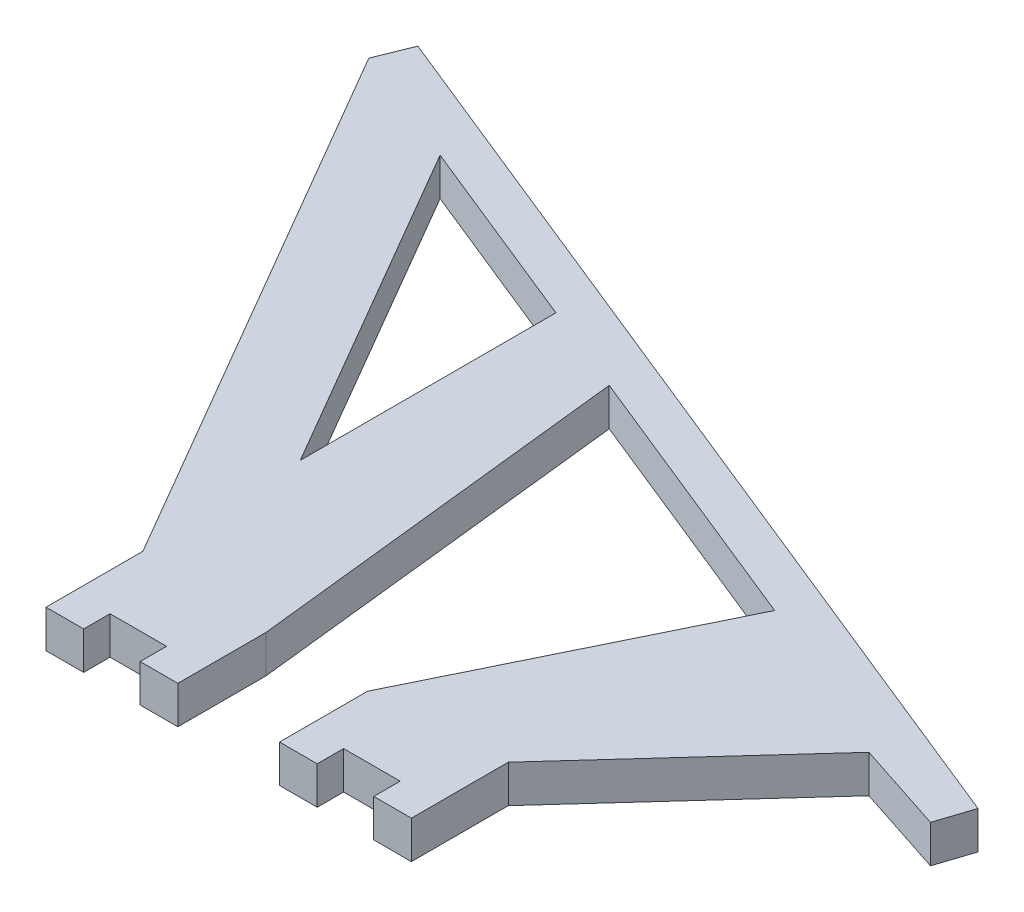
ISO-10303-21;
HEADER;
FILE_DESCRIPTION(('STEP AP214'),'2;1');
FILE_NAME('part.step','',(''),(''),'','','');
FILE_SCHEMA(('AUTOMOTIVE_DESIGN { 1 0 10303 214 1 1 1 1 }'));
ENDSEC;
DATA;
#1=APPLICATION_CONTEXT('core data for automotive mechanical design processes');
#2=APPLICATION_PROTOCOL_DEFINITION('international standard','automotive_design',2000,#1);
#3=PRODUCT_CONTEXT('',#1,'mechanical');
#4=PRODUCT('Part','Part','',(#3));
#5=PRODUCT_RELATED_PRODUCT_CATEGORY('part','',(#4));
#6=PRODUCT_DEFINITION_FORMATION('','',#4);
#7=PRODUCT_DEFINITION_CONTEXT('part definition',#1,'design');
#8=PRODUCT_DEFINITION('design','',#6,#7);
#9=PRODUCT_DEFINITION_SHAPE('','',#8);
#10=(LENGTH_UNIT() NAMED_UNIT(*) SI_UNIT(.MILLI.,.METRE.));
#11=(NAMED_UNIT(*) PLANE_ANGLE_UNIT() SI_UNIT($,.RADIAN.));
#12=(NAMED_UNIT(*) SI_UNIT($,.STERADIAN.) SOLID_ANGLE_UNIT());
#13=UNCERTAINTY_MEASURE_WITH_UNIT(LENGTH_MEASURE(1.E-05),#10,'distance_accuracy_value','');
#14=(GEOMETRIC_REPRESENTATION_CONTEXT(3) GLOBAL_UNCERTAINTY_ASSIGNED_CONTEXT((#13)) GLOBAL_UNIT_ASSIGNED_CONTEXT((#10,
#11,#12)) REPRESENTATION_CONTEXT('',''));
#15=CARTESIAN_POINT('',(0.,0.,0.));
#16=DIRECTION('',(0.,0.,1.));
#17=DIRECTION('',(1.,0.,0.));
#18=AXIS2_PLACEMENT_3D('',#15,#16,#17);
#19=CARTESIAN_POINT('',(-48.5,10.,0.));
#20=DIRECTION('',(1.,0.,0.));
#21=DIRECTION('',(0.,0.,-1.));
#22=AXIS2_PLACEMENT_3D('',#19,#20,#21);
#23=PLANE('',#22);
#24=DIRECTION('',(0.,0.,1.));
#25=VECTOR('',#24,1.);
#26=CARTESIAN_POINT('',(-48.5,0.,0.));
#27=LINE('',#26,#25);
#28=CARTESIAN_POINT('',(-48.5,0.,-125.232815318677));
#29=VERTEX_POINT('',#28);
#30=CARTESIAN_POINT('',(-48.5,0.,-57.3695773199546));
#31=VERTEX_POINT('',#30);
#32=EDGE_CURVE('E237',#29,#31,#27,.T.);
#33=ORIENTED_EDGE('',*,*,#32,.T.);
#34=DIRECTION('',(0.,-1.,0.));
#35=VECTOR('',#34,1.);
#36=CARTESIAN_POINT('',(-48.5,10.,-57.3695773199546));
#37=LINE('',#36,#35);
#38=CARTESIAN_POINT('',(-48.5,10.,-57.3695773199546));
#39=VERTEX_POINT('',#38);
#40=EDGE_CURVE('E11',#39,#31,#37,.T.);
#41=ORIENTED_EDGE('',*,*,#40,.F.);
#42=DIRECTION('',(0.,0.,1.));
#43=VECTOR('',#42,1.);
#44=CARTESIAN_POINT('',(-48.5,10.,0.));
#45=LINE('',#44,#43);
#46=CARTESIAN_POINT('',(-48.5,10.,-125.232815318677));
#47=VERTEX_POINT('',#46);
#48=EDGE_CURVE('E228',#47,#39,#45,.T.);
#49=ORIENTED_EDGE('',*,*,#48,.F.);
#50=DIRECTION('',(0.,-1.,0.));
#51=VECTOR('',#50,1.);
#52=CARTESIAN_POINT('',(-48.5,10.,-125.232815318677));
#53=LINE('',#52,#51);
#54=EDGE_CURVE('E238',#47,#29,#53,.T.);
#55=ORIENTED_EDGE('',*,*,#54,.T.);
#56=EDGE_LOOP('',(#33,#41,#49,#55));
#57=FACE_BOUND('',#56,.T.);
#58=ADVANCED_FACE('F41',(#57),#23,.F.);
#59=CARTESIAN_POINT('',(-11.3048115976021,10.,6.57569485477312));
#60=DIRECTION('',(-0.864403175611041,0.,0.502799313835598));
#61=DIRECTION('',(0.502799313835599,0.,0.864403175611041));
#62=AXIS2_PLACEMENT_3D('',#59,#60,#61);
#63=PLANE('',#62);
#64=DIRECTION('',(-0.502799313835598,0.,-0.864403175611041));
#65=VECTOR('',#64,1.);
#66=CARTESIAN_POINT('',(-11.3048115976021,0.,6.57569485477312));
#67=LINE('',#66,#65);
#68=CARTESIAN_POINT('',(-100.110149338396,0.,-146.096780707619));
#69=VERTEX_POINT('',#68);
#70=EDGE_CURVE('E142',#31,#69,#67,.T.);
#71=ORIENTED_EDGE('',*,*,#70,.T.);
#72=DIRECTION('',(0.,-1.,0.));
#73=VECTOR('',#72,1.);
#74=CARTESIAN_POINT('',(-100.110149338396,10.,-146.096780707619));
#75=LINE('',#74,#73);
#76=CARTESIAN_POINT('',(-100.110149338396,10.,-146.096780707619));
#77=VERTEX_POINT('',#76);
#78=EDGE_CURVE('E52',#77,#69,#75,.T.);
#79=ORIENTED_EDGE('',*,*,#78,.F.);
#80=DIRECTION('',(-0.502799313835598,0.,-0.864403175611041));
#81=VECTOR('',#80,1.);
#82=CARTESIAN_POINT('',(-11.3048115976021,10.,6.57569485477312));
#83=LINE('',#82,#81);
#84=EDGE_CURVE('E223',#39,#77,#83,.T.);
#85=ORIENTED_EDGE('',*,*,#84,.F.);
#86=ORIENTED_EDGE('',*,*,#40,.T.);
#87=EDGE_LOOP('',(#71,#79,#85,#86));
#88=FACE_BOUND('',#87,.T.);
#89=ADVANCED_FACE('F224',(#88),#63,.F.);
#90=CARTESIAN_POINT('',(-29.457278285434,10.,17.1344804453207));
#91=DIRECTION('',(-0.864403175611041,0.,0.502799313835598));
#92=DIRECTION('',(0.502799313835599,0.,0.864403175611041));
#93=AXIS2_PLACEMENT_3D('',#90,#91,#92);
#94=PLANE('',#93);
#95=DIRECTION('',(-0.502799313835598,0.,-0.864403175611041));
#96=VECTOR('',#95,1.);
#97=CARTESIAN_POINT('',(-29.457278285434,0.,17.1344804453207));
#98=LINE('',#97,#96);
#99=CARTESIAN_POINT('',(-48.5,0.,-15.6034105370253));
#100=VERTEX_POINT('',#99);
#101=CARTESIAN_POINT('',(-131.873415703611,0.,-158.937427335832));
#102=VERTEX_POINT('',#101);
#103=EDGE_CURVE('E340',#100,#102,#98,.T.);
#104=ORIENTED_EDGE('',*,*,#103,.F.);
#105=DIRECTION('',(0.,-1.,0.));
#106=VECTOR('',#105,1.);
#107=CARTESIAN_POINT('',(-48.5,10.,-15.6034105370253));
#108=LINE('',#107,#106);
#109=CARTESIAN_POINT('',(-48.5,10.,-15.6034105370253));
#110=VERTEX_POINT('',#109);
#111=EDGE_CURVE('E45',#110,#100,#108,.T.);
#112=ORIENTED_EDGE('',*,*,#111,.F.);
#113=DIRECTION('',(-0.502799313835598,0.,-0.864403175611041));
#114=VECTOR('',#113,1.);
#115=CARTESIAN_POINT('',(-29.457278285434,10.,17.1344804453207));
#116=LINE('',#115,#114);
#117=CARTESIAN_POINT('',(-131.873415703611,10.,-158.937427335832));
#118=VERTEX_POINT('',#117);
#119=EDGE_CURVE('E253',#110,#118,#116,.T.);
#120=ORIENTED_EDGE('',*,*,#119,.T.);
#121=DIRECTION('',(0.,-1.,0.));
#122=VECTOR('',#121,1.);
#123=CARTESIAN_POINT('',(-131.873415703611,10.,-158.937427335832));
#124=LINE('',#123,#122);
#125=EDGE_CURVE('E258',#118,#102,#124,.T.);
#126=ORIENTED_EDGE('',*,*,#125,.T.);
#127=EDGE_LOOP('',(#104,#112,#120,#126));
#128=FACE_BOUND('',#127,.T.);
#129=ADVANCED_FACE('F43',(#128),#94,.T.);
#130=CARTESIAN_POINT('',(-48.5,10.,0.));
#131=DIRECTION('',(-1.,0.,0.));
#132=DIRECTION('',(0.,0.,1.));
#133=AXIS2_PLACEMENT_3D('',#130,#131,#132);
#134=PLANE('',#133);
#135=DIRECTION('',(0.,0.,-1.));
#136=VECTOR('',#135,1.);
#137=CARTESIAN_POINT('',(-48.5,0.,0.));
#138=LINE('',#137,#136);
#139=CARTESIAN_POINT('',(-48.5,0.,10.1281938448075));
#140=VERTEX_POINT('',#139);
#141=EDGE_CURVE('E336',#140,#100,#138,.T.);
#142=ORIENTED_EDGE('',*,*,#141,.F.);
#143=DIRECTION('',(0.,-1.,0.));
#144=VECTOR('',#143,1.);
#145=CARTESIAN_POINT('',(-48.5,10.,10.1281938448075));
#146=LINE('',#145,#144);
#147=CARTESIAN_POINT('',(-48.5,10.,10.1281938448075));
#148=VERTEX_POINT('',#147);
#149=EDGE_CURVE('E324',#148,#140,#146,.T.);
#150=ORIENTED_EDGE('',*,*,#149,.F.);
#151=DIRECTION('',(0.,0.,-1.));
#152=VECTOR('',#151,1.);
#153=CARTESIAN_POINT('',(-48.5,10.,0.));
#154=LINE('',#153,#152);
#155=EDGE_CURVE('E338',#148,#110,#154,.T.);
#156=ORIENTED_EDGE('',*,*,#155,.T.);
#157=ORIENTED_EDGE('',*,*,#111,.T.);
#158=EDGE_LOOP('',(#142,#150,#156,#157));
#159=FACE_BOUND('',#158,.T.);
#160=ADVANCED_FACE('F334',(#159),#134,.T.);
#161=CARTESIAN_POINT('',(0.,10.,10.1281938448075));
#162=DIRECTION('',(0.,0.,-1.));
#163=DIRECTION('',(-1.,0.,0.));
#164=AXIS2_PLACEMENT_3D('',#161,#162,#163);
#165=PLANE('',#164);
#166=DIRECTION('',(1.,0.,0.));
#167=VECTOR('',#166,1.);
#168=CARTESIAN_POINT('',(0.,0.,10.1281938448075));
#169=LINE('',#168,#167);
#170=CARTESIAN_POINT('',(-38.5,0.,10.1281938448075));
#171=VERTEX_POINT('',#170);
#172=EDGE_CURVE('E348',#140,#171,#169,.T.);
#173=ORIENTED_EDGE('',*,*,#172,.T.);
#174=DIRECTION('',(0.,-1.,0.));
#175=VECTOR('',#174,1.);
#176=CARTESIAN_POINT('',(-38.5,10.,10.1281938448075));
#177=LINE('',#176,#175);
#178=CARTESIAN_POINT('',(-38.5,10.,10.1281938448075));
#179=VERTEX_POINT('',#178);
#180=EDGE_CURVE('E322',#179,#171,#177,.T.);
#181=ORIENTED_EDGE('',*,*,#180,.F.);
#182=DIRECTION('',(1.,0.,0.));
#183=VECTOR('',#182,1.);
#184=CARTESIAN_POINT('',(0.,10.,10.1281938448075));
#185=LINE('',#184,#183);
#186=EDGE_CURVE('E507',#148,#179,#185,.T.);
#187=ORIENTED_EDGE('',*,*,#186,.F.);
#188=ORIENTED_EDGE('',*,*,#149,.T.);
#189=EDGE_LOOP('',(#173,#181,#187,#188));
#190=FACE_BOUND('',#189,.T.);
#191=ADVANCED_FACE('F516',(#190),#165,.F.);
#192=CARTESIAN_POINT('',(-38.5,10.,0.));
#193=DIRECTION('',(1.,0.,0.));
#194=DIRECTION('',(0.,0.,-1.));
#195=AXIS2_PLACEMENT_3D('',#192,#193,#194);
#196=PLANE('',#195);
#197=DIRECTION('',(0.,0.,1.));
#198=VECTOR('',#197,1.);
#199=CARTESIAN_POINT('',(-38.5,0.,0.));
#200=LINE('',#199,#198);
#201=CARTESIAN_POINT('',(-38.5,0.,3.12598575457023));
#202=VERTEX_POINT('',#201);
#203=EDGE_CURVE('E352',#202,#171,#200,.T.);
#204=ORIENTED_EDGE('',*,*,#203,.F.);
#205=DIRECTION('',(0.,-1.,0.));
#206=VECTOR('',#205,1.);
#207=CARTESIAN_POINT('',(-38.5,10.,3.12598575457023));
#208=LINE('',#207,#206);
#209=CARTESIAN_POINT('',(-38.5,10.,3.12598575457023));
#210=VERTEX_POINT('',#209);
#211=EDGE_CURVE('E319',#210,#202,#208,.T.);
#212=ORIENTED_EDGE('',*,*,#211,.F.);
#213=DIRECTION('',(0.,0.,1.));
#214=VECTOR('',#213,1.);
#215=CARTESIAN_POINT('',(-38.5,10.,0.));
#216=LINE('',#215,#214);
#217=EDGE_CURVE('E503',#210,#179,#216,.T.);
#218=ORIENTED_EDGE('',*,*,#217,.T.);
#219=ORIENTED_EDGE('',*,*,#180,.T.);
#220=EDGE_LOOP('',(#204,#212,#218,#219));
#221=FACE_BOUND('',#220,.T.);
#222=ADVANCED_FACE('F519',(#221),#196,.T.);
#223=CARTESIAN_POINT('',(0.,10.,3.12598575457022));
#224=DIRECTION('',(0.,0.,1.));
#225=DIRECTION('',(1.,0.,0.));
#226=AXIS2_PLACEMENT_3D('',#223,#224,#225);
#227=PLANE('',#226);
#228=DIRECTION('',(-1.,0.,0.));
#229=VECTOR('',#228,1.);
#230=CARTESIAN_POINT('',(0.,0.,3.12598575457022));
#231=LINE('',#230,#229);
#232=CARTESIAN_POINT('',(-23.5,0.,3.12598575457022));
#233=VERTEX_POINT('',#232);
#234=EDGE_CURVE('E358',#233,#202,#231,.T.);
#235=ORIENTED_EDGE('',*,*,#234,.F.);
#236=DIRECTION('',(0.,-1.,0.));
#237=VECTOR('',#236,1.);
#238=CARTESIAN_POINT('',(-23.5,10.,3.12598575457022));
#239=LINE('',#238,#237);
#240=CARTESIAN_POINT('',(-23.5,10.,3.12598575457022));
#241=VERTEX_POINT('',#240);
#242=EDGE_CURVE('E316',#241,#233,#239,.T.);
#243=ORIENTED_EDGE('',*,*,#242,.F.);
#244=DIRECTION('',(-1.,0.,0.));
#245=VECTOR('',#244,1.);
#246=CARTESIAN_POINT('',(0.,10.,3.12598575457022));
#247=LINE('',#246,#245);
#248=EDGE_CURVE('E499',#241,#210,#247,.T.);
#249=ORIENTED_EDGE('',*,*,#248,.T.);
#250=ORIENTED_EDGE('',*,*,#211,.T.);
#251=EDGE_LOOP('',(#235,#243,#249,#250));
#252=FACE_BOUND('',#251,.T.);
#253=ADVANCED_FACE('F522',(#252),#227,.T.);
#254=CARTESIAN_POINT('',(-23.5,10.,0.));
#255=DIRECTION('',(1.,0.,0.));
#256=DIRECTION('',(0.,0.,-1.));
#257=AXIS2_PLACEMENT_3D('',#254,#255,#256);
#258=PLANE('',#257);
#259=DIRECTION('',(0.,0.,1.));
#260=VECTOR('',#259,1.);
#261=CARTESIAN_POINT('',(-23.5,0.,0.));
#262=LINE('',#261,#260);
#263=CARTESIAN_POINT('',(-23.5,0.,10.1281938448075));
#264=VERTEX_POINT('',#263);
#265=EDGE_CURVE('E362',#233,#264,#262,.T.);
#266=ORIENTED_EDGE('',*,*,#265,.T.);
#267=DIRECTION('',(0.,-1.,0.));
#268=VECTOR('',#267,1.);
#269=CARTESIAN_POINT('',(-23.5,10.,10.1281938448075));
#270=LINE('',#269,#268);
#271=CARTESIAN_POINT('',(-23.5,10.,10.1281938448075));
#272=VERTEX_POINT('',#271);
#273=EDGE_CURVE('E313',#272,#264,#270,.T.);
#274=ORIENTED_EDGE('',*,*,#273,.F.);
#275=DIRECTION('',(0.,0.,1.));
#276=VECTOR('',#275,1.);
#277=CARTESIAN_POINT('',(-23.5,10.,0.));
#278=LINE('',#277,#276);
#279=EDGE_CURVE('E496',#241,#272,#278,.T.);
#280=ORIENTED_EDGE('',*,*,#279,.F.);
#281=ORIENTED_EDGE('',*,*,#242,.T.);
#282=EDGE_LOOP('',(#266,#274,#280,#281));
#283=FACE_BOUND('',#282,.T.);
#284=ADVANCED_FACE('F528',(#283),#258,.F.);
#285=CARTESIAN_POINT('',(0.,10.,10.1281938448075));
#286=DIRECTION('',(0.,0.,1.));
#287=DIRECTION('',(1.,0.,0.));
#288=AXIS2_PLACEMENT_3D('',#285,#286,#287);
#289=PLANE('',#288);
#290=DIRECTION('',(-1.,0.,0.));
#291=VECTOR('',#290,1.);
#292=CARTESIAN_POINT('',(0.,0.,10.1281938448075));
#293=LINE('',#292,#291);
#294=CARTESIAN_POINT('',(-13.5,0.,10.1281938448075));
#295=VERTEX_POINT('',#294);
#296=EDGE_CURVE('E366',#295,#264,#293,.T.);
#297=ORIENTED_EDGE('',*,*,#296,.F.);
#298=DIRECTION('',(0.,-1.,0.));
#299=VECTOR('',#298,1.);
#300=CARTESIAN_POINT('',(-13.5,10.,10.1281938448075));
#301=LINE('',#300,#299);
#302=CARTESIAN_POINT('',(-13.5,10.,10.1281938448075));
#303=VERTEX_POINT('',#302);
#304=EDGE_CURVE('E310',#303,#295,#301,.T.);
#305=ORIENTED_EDGE('',*,*,#304,.F.);
#306=DIRECTION('',(-1.,0.,0.));
#307=VECTOR('',#306,1.);
#308=CARTESIAN_POINT('',(0.,10.,10.1281938448075));
#309=LINE('',#308,#307);
#310=EDGE_CURVE('E492',#303,#272,#309,.T.);
#311=ORIENTED_EDGE('',*,*,#310,.T.);
#312=ORIENTED_EDGE('',*,*,#273,.T.);
#313=EDGE_LOOP('',(#297,#305,#311,#312));
#314=FACE_BOUND('',#313,.T.);
#315=ADVANCED_FACE('F532',(#314),#289,.T.);
#316=CARTESIAN_POINT('',(-13.5,10.,0.));
#317=DIRECTION('',(1.,0.,0.));
#318=DIRECTION('',(0.,0.,-1.));
#319=AXIS2_PLACEMENT_3D('',#316,#317,#318);
#320=PLANE('',#319);
#321=DIRECTION('',(0.,0.,1.));
#322=VECTOR('',#321,1.);
#323=CARTESIAN_POINT('',(-13.5,0.,0.));
#324=LINE('',#323,#322);
#325=CARTESIAN_POINT('',(-13.5,0.,-13.2146995940935));
#326=VERTEX_POINT('',#325);
#327=EDGE_CURVE('E370',#326,#295,#324,.T.);
#328=ORIENTED_EDGE('',*,*,#327,.F.);
#329=DIRECTION('',(0.,-1.,0.));
#330=VECTOR('',#329,1.);
#331=CARTESIAN_POINT('',(-13.5,10.,-13.2146995940935));
#332=LINE('',#331,#330);
#333=CARTESIAN_POINT('',(-13.5,10.,-13.2146995940935));
#334=VERTEX_POINT('',#333);
#335=EDGE_CURVE('E307',#334,#326,#332,.T.);
#336=ORIENTED_EDGE('',*,*,#335,.F.);
#337=DIRECTION('',(0.,0.,1.));
#338=VECTOR('',#337,1.);
#339=CARTESIAN_POINT('',(-13.5,10.,0.));
#340=LINE('',#339,#338);
#341=EDGE_CURVE('E488',#334,#303,#340,.T.);
#342=ORIENTED_EDGE('',*,*,#341,.T.);
#343=ORIENTED_EDGE('',*,*,#304,.T.);
#344=EDGE_LOOP('',(#328,#336,#342,#343));
#345=FACE_BOUND('',#344,.T.);
#346=ADVANCED_FACE('F535',(#345),#320,.T.);
#347=CARTESIAN_POINT('',(-11.9066691086796,10.,1.30645681191983));
#348=DIRECTION('',(0.994034051509368,0.,-0.109070181259005));
#349=DIRECTION('',(-0.109070181259005,0.,-0.994034051509368));
#350=AXIS2_PLACEMENT_3D('',#347,#348,#349);
#351=PLANE('',#350);
#352=DIRECTION('',(0.109070181259005,0.,0.994034051509368));
#353=VECTOR('',#352,1.);
#354=CARTESIAN_POINT('',(-11.9066691086796,0.,1.30645681191983));
#355=LINE('',#354,#353);
#356=CARTESIAN_POINT('',(-24.7371032860782,0.,-115.62640532111));
#357=VERTEX_POINT('',#356);
#358=EDGE_CURVE('E374',#357,#326,#355,.T.);
#359=ORIENTED_EDGE('',*,*,#358,.F.);
#360=DIRECTION('',(0.,-1.,0.));
#361=VECTOR('',#360,1.);
#362=CARTESIAN_POINT('',(-24.7371032860782,10.,-115.62640532111));
#363=LINE('',#362,#361);
#364=CARTESIAN_POINT('',(-24.7371032860782,10.,-115.62640532111));
#365=VERTEX_POINT('',#364);
#366=EDGE_CURVE('E304',#365,#357,#363,.T.);
#367=ORIENTED_EDGE('',*,*,#366,.F.);
#368=DIRECTION('',(0.109070181259005,0.,0.994034051509368));
#369=VECTOR('',#368,1.);
#370=CARTESIAN_POINT('',(-11.9066691086796,10.,1.30645681191983));
#371=LINE('',#370,#369);
#372=EDGE_CURVE('E484',#365,#334,#371,.T.);
#373=ORIENTED_EDGE('',*,*,#372,.T.);
#374=ORIENTED_EDGE('',*,*,#335,.T.);
#375=EDGE_LOOP('',(#359,#367,#373,#374));
#376=FACE_BOUND('',#375,.T.);
#377=ADVANCED_FACE('F540',(#376),#351,.T.);
#378=CARTESIAN_POINT('',(36.7023730092341,10.,-90.7888273762122));
#379=DIRECTION('',(-0.374793622273002,0.,0.927108268059067));
#380=DIRECTION('',(0.927108268059067,0.,0.374793622273002));
#381=AXIS2_PLACEMENT_3D('',#378,#379,#380);
#382=PLANE('',#381);
#383=DIRECTION('',(-0.927108268059067,0.,-0.374793622273002));
#384=VECTOR('',#383,1.);
#385=CARTESIAN_POINT('',(36.7023730092341,0.,-90.7888273762122));
#386=LINE('',#385,#384);
#387=CARTESIAN_POINT('',(48.97130634377,0.,-85.8289773518958));
#388=VERTEX_POINT('',#387);
#389=EDGE_CURVE('E378',#388,#357,#386,.T.);
#390=ORIENTED_EDGE('',*,*,#389,.F.);
#391=DIRECTION('',(0.,-1.,0.));
#392=VECTOR('',#391,1.);
#393=CARTESIAN_POINT('',(48.97130634377,10.,-85.8289773518958));
#394=LINE('',#393,#392);
#395=CARTESIAN_POINT('',(48.97130634377,10.,-85.8289773518958));
#396=VERTEX_POINT('',#395);
#397=EDGE_CURVE('E301',#396,#388,#394,.T.);
#398=ORIENTED_EDGE('',*,*,#397,.F.);
#399=DIRECTION('',(-0.927108268059067,0.,-0.374793622273002));
#400=VECTOR('',#399,1.);
#401=CARTESIAN_POINT('',(36.7023730092341,10.,-90.7888273762122));
#402=LINE('',#401,#400);
#403=EDGE_CURVE('E480',#396,#365,#402,.T.);
#404=ORIENTED_EDGE('',*,*,#403,.T.);
#405=ORIENTED_EDGE('',*,*,#366,.T.);
#406=EDGE_LOOP('',(#390,#398,#404,#405));
#407=FACE_BOUND('',#406,.T.);
#408=ADVANCED_FACE('F543',(#407),#382,.T.);
#409=CARTESIAN_POINT('',(5.68757827102763,10.,2.77832180440731));
#410=DIRECTION('',(-0.898525942283083,0.,-0.438920415387912));
#411=DIRECTION('',(-0.438920415387912,0.,0.898525942283083));
#412=AXIS2_PLACEMENT_3D('',#409,#410,#411);
#413=PLANE('',#412);
#414=DIRECTION('',(0.438920415387912,0.,-0.898525942283083));
#415=VECTOR('',#414,1.);
#416=CARTESIAN_POINT('',(5.68757827102763,0.,2.77832180440731));
#417=LINE('',#416,#415);
#418=CARTESIAN_POINT('',(13.5,0.,-13.2146995940935));
#419=VERTEX_POINT('',#418);
#420=EDGE_CURVE('E382',#419,#388,#417,.T.);
#421=ORIENTED_EDGE('',*,*,#420,.F.);
#422=DIRECTION('',(0.,-1.,0.));
#423=VECTOR('',#422,1.);
#424=CARTESIAN_POINT('',(13.5,10.,-13.2146995940935));
#425=LINE('',#424,#423);
#426=CARTESIAN_POINT('',(13.5,10.,-13.2146995940935));
#427=VERTEX_POINT('',#426);
#428=EDGE_CURVE('E298',#427,#419,#425,.T.);
#429=ORIENTED_EDGE('',*,*,#428,.F.);
#430=DIRECTION('',(0.438920415387912,0.,-0.898525942283083));
#431=VECTOR('',#430,1.);
#432=CARTESIAN_POINT('',(5.68757827102763,10.,2.77832180440731));
#433=LINE('',#432,#431);
#434=EDGE_CURVE('E476',#427,#396,#433,.T.);
#435=ORIENTED_EDGE('',*,*,#434,.T.);
#436=ORIENTED_EDGE('',*,*,#397,.T.);
#437=EDGE_LOOP('',(#421,#429,#435,#436));
#438=FACE_BOUND('',#437,.T.);
#439=ADVANCED_FACE('F548',(#438),#413,.T.);
#440=CARTESIAN_POINT('',(13.5,10.,0.));
#441=DIRECTION('',(-1.,0.,0.));
#442=DIRECTION('',(0.,0.,1.));
#443=AXIS2_PLACEMENT_3D('',#440,#441,#442);
#444=PLANE('',#443);
#445=DIRECTION('',(0.,0.,-1.));
#446=VECTOR('',#445,1.);
#447=CARTESIAN_POINT('',(13.5,0.,0.));
#448=LINE('',#447,#446);
#449=CARTESIAN_POINT('',(13.5,0.,10.1281938448075));
#450=VERTEX_POINT('',#449);
#451=EDGE_CURVE('E386',#450,#419,#448,.T.);
#452=ORIENTED_EDGE('',*,*,#451,.F.);
#453=DIRECTION('',(0.,-1.,0.));
#454=VECTOR('',#453,1.);
#455=CARTESIAN_POINT('',(13.5,10.,10.1281938448075));
#456=LINE('',#455,#454);
#457=CARTESIAN_POINT('',(13.5,10.,10.1281938448075));
#458=VERTEX_POINT('',#457);
#459=EDGE_CURVE('E295',#458,#450,#456,.T.);
#460=ORIENTED_EDGE('',*,*,#459,.F.);
#461=DIRECTION('',(0.,0.,-1.));
#462=VECTOR('',#461,1.);
#463=CARTESIAN_POINT('',(13.5,10.,0.));
#464=LINE('',#463,#462);
#465=EDGE_CURVE('E472',#458,#427,#464,.T.);
#466=ORIENTED_EDGE('',*,*,#465,.T.);
#467=ORIENTED_EDGE('',*,*,#428,.T.);
#468=EDGE_LOOP('',(#452,#460,#466,#467));
#469=FACE_BOUND('',#468,.T.);
#470=ADVANCED_FACE('F551',(#469),#444,.T.);
#471=CARTESIAN_POINT('',(0.,10.,10.1281938448075));
#472=DIRECTION('',(0.,0.,-1.));
#473=DIRECTION('',(-1.,0.,0.));
#474=AXIS2_PLACEMENT_3D('',#471,#472,#473);
#475=PLANE('',#474);
#476=DIRECTION('',(1.,0.,0.));
#477=VECTOR('',#476,1.);
#478=CARTESIAN_POINT('',(0.,0.,10.1281938448075));
#479=LINE('',#478,#477);
#480=CARTESIAN_POINT('',(23.5,0.,10.1281938448075));
#481=VERTEX_POINT('',#480);
#482=EDGE_CURVE('E390',#450,#481,#479,.T.);
#483=ORIENTED_EDGE('',*,*,#482,.T.);
#484=DIRECTION('',(0.,-1.,0.));
#485=VECTOR('',#484,1.);
#486=CARTESIAN_POINT('',(23.5,10.,10.1281938448075));
#487=LINE('',#486,#485);
#488=CARTESIAN_POINT('',(23.5,10.,10.1281938448075));
#489=VERTEX_POINT('',#488);
#490=EDGE_CURVE('E292',#489,#481,#487,.T.);
#491=ORIENTED_EDGE('',*,*,#490,.F.);
#492=DIRECTION('',(1.,0.,0.));
#493=VECTOR('',#492,1.);
#494=CARTESIAN_POINT('',(0.,10.,10.1281938448075));
#495=LINE('',#494,#493);
#496=EDGE_CURVE('E469',#458,#489,#495,.T.);
#497=ORIENTED_EDGE('',*,*,#496,.F.);
#498=ORIENTED_EDGE('',*,*,#459,.T.);
#499=EDGE_LOOP('',(#483,#491,#497,#498));
#500=FACE_BOUND('',#499,.T.);
#501=ADVANCED_FACE('F556',(#500),#475,.F.);
#502=CARTESIAN_POINT('',(23.5,10.,0.));
#503=DIRECTION('',(1.,0.,0.));
#504=DIRECTION('',(0.,0.,-1.));
#505=AXIS2_PLACEMENT_3D('',#502,#503,#504);
#506=PLANE('',#505);
#507=DIRECTION('',(0.,0.,1.));
#508=VECTOR('',#507,1.);
#509=CARTESIAN_POINT('',(23.5,0.,0.));
#510=LINE('',#509,#508);
#511=CARTESIAN_POINT('',(23.5,0.,3.12598575457021));
#512=VERTEX_POINT('',#511);
#513=EDGE_CURVE('E394',#512,#481,#510,.T.);
#514=ORIENTED_EDGE('',*,*,#513,.F.);
#515=DIRECTION('',(0.,-1.,0.));
#516=VECTOR('',#515,1.);
#517=CARTESIAN_POINT('',(23.5,10.,3.12598575457021));
#518=LINE('',#517,#516);
#519=CARTESIAN_POINT('',(23.5,10.,3.12598575457021));
#520=VERTEX_POINT('',#519);
#521=EDGE_CURVE('E289',#520,#512,#518,.T.);
#522=ORIENTED_EDGE('',*,*,#521,.F.);
#523=DIRECTION('',(0.,0.,1.));
#524=VECTOR('',#523,1.);
#525=CARTESIAN_POINT('',(23.5,10.,0.));
#526=LINE('',#525,#524);
#527=EDGE_CURVE('E465',#520,#489,#526,.T.);
#528=ORIENTED_EDGE('',*,*,#527,.T.);
#529=ORIENTED_EDGE('',*,*,#490,.T.);
#530=EDGE_LOOP('',(#514,#522,#528,#529));
#531=FACE_BOUND('',#530,.T.);
#532=ADVANCED_FACE('F560',(#531),#506,.T.);
#533=CARTESIAN_POINT('',(0.,10.,3.12598575457021));
#534=DIRECTION('',(0.,0.,-1.));
#535=DIRECTION('',(-1.,0.,0.));
#536=AXIS2_PLACEMENT_3D('',#533,#534,#535);
#537=PLANE('',#536);
#538=DIRECTION('',(1.,0.,0.));
#539=VECTOR('',#538,1.);
#540=CARTESIAN_POINT('',(0.,0.,3.12598575457021));
#541=LINE('',#540,#539);
#542=CARTESIAN_POINT('',(38.5,0.,3.12598575457021));
#543=VERTEX_POINT('',#542);
#544=EDGE_CURVE('E398',#512,#543,#541,.T.);
#545=ORIENTED_EDGE('',*,*,#544,.T.);
#546=DIRECTION('',(0.,-1.,0.));
#547=VECTOR('',#546,1.);
#548=CARTESIAN_POINT('',(38.5,10.,3.12598575457021));
#549=LINE('',#548,#547);
#550=CARTESIAN_POINT('',(38.5,10.,3.12598575457021));
#551=VERTEX_POINT('',#550);
#552=EDGE_CURVE('E285',#551,#543,#549,.T.);
#553=ORIENTED_EDGE('',*,*,#552,.F.);
#554=DIRECTION('',(1.,0.,0.));
#555=VECTOR('',#554,1.);
#556=CARTESIAN_POINT('',(0.,10.,3.12598575457021));
#557=LINE('',#556,#555);
#558=EDGE_CURVE('E462',#520,#551,#557,.T.);
#559=ORIENTED_EDGE('',*,*,#558,.F.);
#560=ORIENTED_EDGE('',*,*,#521,.T.);
#561=EDGE_LOOP('',(#545,#553,#559,#560));
#562=FACE_BOUND('',#561,.T.);
#563=ADVANCED_FACE('F565',(#562),#537,.F.);
#564=CARTESIAN_POINT('',(38.5,10.,0.));
#565=DIRECTION('',(1.,0.,0.));
#566=DIRECTION('',(0.,0.,-1.));
#567=AXIS2_PLACEMENT_3D('',#564,#565,#566);
#568=PLANE('',#567);
#569=DIRECTION('',(0.,0.,1.));
#570=VECTOR('',#569,1.);
#571=CARTESIAN_POINT('',(38.5,0.,0.));
#572=LINE('',#571,#570);
#573=CARTESIAN_POINT('',(38.5,0.,10.1281938448075));
#574=VERTEX_POINT('',#573);
#575=EDGE_CURVE('E401',#543,#574,#572,.T.);
#576=ORIENTED_EDGE('',*,*,#575,.T.);
#577=DIRECTION('',(0.,-1.,0.));
#578=VECTOR('',#577,1.);
#579=CARTESIAN_POINT('',(38.5,10.,10.1281938448075));
#580=LINE('',#579,#578);
#581=CARTESIAN_POINT('',(38.5,10.,10.1281938448075));
#582=VERTEX_POINT('',#581);
#583=EDGE_CURVE('E282',#582,#574,#580,.T.);
#584=ORIENTED_EDGE('',*,*,#583,.F.);
#585=DIRECTION('',(0.,0.,1.));
#586=VECTOR('',#585,1.);
#587=CARTESIAN_POINT('',(38.5,10.,0.));
#588=LINE('',#587,#586);
#589=EDGE_CURVE('E459',#551,#582,#588,.T.);
#590=ORIENTED_EDGE('',*,*,#589,.F.);
#591=ORIENTED_EDGE('',*,*,#552,.T.);
#592=EDGE_LOOP('',(#576,#584,#590,#591));
#593=FACE_BOUND('',#592,.T.);
#594=ADVANCED_FACE('F571',(#593),#568,.F.);
#595=CARTESIAN_POINT('',(0.,10.,10.1281938448075));
#596=DIRECTION('',(0.,0.,1.));
#597=DIRECTION('',(1.,0.,0.));
#598=AXIS2_PLACEMENT_3D('',#595,#596,#597);
#599=PLANE('',#598);
#600=DIRECTION('',(-1.,0.,0.));
#601=VECTOR('',#600,1.);
#602=CARTESIAN_POINT('',(0.,0.,10.1281938448075));
#603=LINE('',#602,#601);
#604=CARTESIAN_POINT('',(48.5,0.,10.1281938448075));
#605=VERTEX_POINT('',#604);
#606=EDGE_CURVE('E405',#605,#574,#603,.T.);
#607=ORIENTED_EDGE('',*,*,#606,.F.);
#608=DIRECTION('',(0.,-1.,0.));
#609=VECTOR('',#608,1.);
#610=CARTESIAN_POINT('',(48.5,10.,10.1281938448075));
#611=LINE('',#610,#609);
#612=CARTESIAN_POINT('',(48.5,10.,10.1281938448075));
#613=VERTEX_POINT('',#612);
#614=EDGE_CURVE('E279',#613,#605,#611,.T.);
#615=ORIENTED_EDGE('',*,*,#614,.F.);
#616=DIRECTION('',(-1.,0.,0.));
#617=VECTOR('',#616,1.);
#618=CARTESIAN_POINT('',(0.,10.,10.1281938448075));
#619=LINE('',#618,#617);
#620=EDGE_CURVE('E455',#613,#582,#619,.T.);
#621=ORIENTED_EDGE('',*,*,#620,.T.);
#622=ORIENTED_EDGE('',*,*,#583,.T.);
#623=EDGE_LOOP('',(#607,#615,#621,#622));
#624=FACE_BOUND('',#623,.T.);
#625=ADVANCED_FACE('F575',(#624),#599,.T.);
#626=CARTESIAN_POINT('',(48.5,10.,0.));
#627=DIRECTION('',(1.,0.,0.));
#628=DIRECTION('',(0.,0.,-1.));
#629=AXIS2_PLACEMENT_3D('',#626,#627,#628);
#630=PLANE('',#629);
#631=DIRECTION('',(0.,0.,1.));
#632=VECTOR('',#631,1.);
#633=CARTESIAN_POINT('',(48.5,0.,0.));
#634=LINE('',#633,#632);
#635=CARTESIAN_POINT('',(48.5,0.,-15.6034105370253));
#636=VERTEX_POINT('',#635);
#637=EDGE_CURVE('E409',#636,#605,#634,.T.);
#638=ORIENTED_EDGE('',*,*,#637,.F.);
#639=DIRECTION('',(0.,-1.,0.));
#640=VECTOR('',#639,1.);
#641=CARTESIAN_POINT('',(48.5,10.,-15.6034105370253));
#642=LINE('',#641,#640);
#643=CARTESIAN_POINT('',(48.5,10.,-15.6034105370253));
#644=VERTEX_POINT('',#643);
#645=EDGE_CURVE('E276',#644,#636,#642,.T.);
#646=ORIENTED_EDGE('',*,*,#645,.F.);
#647=DIRECTION('',(0.,0.,1.));
#648=VECTOR('',#647,1.);
#649=CARTESIAN_POINT('',(48.5,10.,0.));
#650=LINE('',#649,#648);
#651=EDGE_CURVE('E451',#644,#613,#650,.T.);
#652=ORIENTED_EDGE('',*,*,#651,.T.);
#653=ORIENTED_EDGE('',*,*,#614,.T.);
#654=EDGE_LOOP('',(#638,#646,#652,#653));
#655=FACE_BOUND('',#654,.T.);
#656=ADVANCED_FACE('F578',(#655),#630,.T.);
#657=CARTESIAN_POINT('',(18.7884487632107,10.,17.0800262464898));
#658=DIRECTION('',(0.739947555999902,0.,0.672664563039984));
#659=DIRECTION('',(0.672664563039984,0.,-0.739947555999902));
#660=AXIS2_PLACEMENT_3D('',#657,#658,#659);
#661=PLANE('',#660);
#662=DIRECTION('',(-0.672664563039984,0.,0.739947555999902));
#663=VECTOR('',#662,1.);
#664=CARTESIAN_POINT('',(18.7884487632107,0.,17.0800262464898));
#665=LINE('',#664,#663);
#666=CARTESIAN_POINT('',(94.0825830979151,0.,-65.7453725381659));
#667=VERTEX_POINT('',#666);
#668=EDGE_CURVE('E413',#667,#636,#665,.T.);
#669=ORIENTED_EDGE('',*,*,#668,.F.);
#670=DIRECTION('',(0.,-1.,0.));
#671=VECTOR('',#670,1.);
#672=CARTESIAN_POINT('',(94.0825830979151,10.,-65.7453725381659));
#673=LINE('',#672,#671);
#674=CARTESIAN_POINT('',(94.0825830979151,10.,-65.7453725381659));
#675=VERTEX_POINT('',#674);
#676=EDGE_CURVE('E273',#675,#667,#673,.T.);
#677=ORIENTED_EDGE('',*,*,#676,.F.);
#678=DIRECTION('',(-0.672664563039984,0.,0.739947555999902));
#679=VECTOR('',#678,1.);
#680=CARTESIAN_POINT('',(18.7884487632107,10.,17.0800262464898));
#681=LINE('',#680,#679);
#682=EDGE_CURVE('E447',#675,#644,#681,.T.);
#683=ORIENTED_EDGE('',*,*,#682,.T.);
#684=ORIENTED_EDGE('',*,*,#645,.T.);
#685=EDGE_LOOP('',(#669,#677,#683,#684));
#686=FACE_BOUND('',#685,.T.);
#687=ADVANCED_FACE('F582',(#686),#661,.T.);
#688=CARTESIAN_POINT('',(28.5275241912671,10.,-87.1933732250199));
#689=DIRECTION('',(0.310955480831546,0.,-0.950424478294211));
#690=DIRECTION('',(-0.950424478294211,0.,-0.310955480831546));
#691=AXIS2_PLACEMENT_3D('',#688,#689,#690);
#692=PLANE('',#691);
#693=DIRECTION('',(0.950424478294211,0.,0.310955480831546));
#694=VECTOR('',#693,1.);
#695=CARTESIAN_POINT('',(28.5275241912671,0.,-87.1933732250199));
#696=LINE('',#695,#694);
#697=CARTESIAN_POINT('',(118.364573122311,0.,-57.8009034551153));
#698=VERTEX_POINT('',#697);
#699=EDGE_CURVE('E417',#667,#698,#696,.T.);
#700=ORIENTED_EDGE('',*,*,#699,.T.);
#701=DIRECTION('',(0.,-1.,0.));
#702=VECTOR('',#701,1.);
#703=CARTESIAN_POINT('',(118.364573122311,10.,-57.8009034551153));
#704=LINE('',#703,#702);
#705=CARTESIAN_POINT('',(118.364573122311,10.,-57.8009034551153));
#706=VERTEX_POINT('',#705);
#707=EDGE_CURVE('E269',#706,#698,#704,.T.);
#708=ORIENTED_EDGE('',*,*,#707,.F.);
#709=DIRECTION('',(0.950424478294211,0.,0.310955480831546));
#710=VECTOR('',#709,1.);
#711=CARTESIAN_POINT('',(28.5275241912671,10.,-87.1933732250199));
#712=LINE('',#711,#710);
#713=EDGE_CURVE('E444',#675,#706,#712,.T.);
#714=ORIENTED_EDGE('',*,*,#713,.F.);
#715=ORIENTED_EDGE('',*,*,#676,.T.);
#716=EDGE_LOOP('',(#700,#708,#714,#715));
#717=FACE_BOUND('',#716,.T.);
#718=ADVANCED_FACE('F587',(#717),#692,.F.);
#719=CARTESIAN_POINT('',(89.837048931044,10.,29.3924697699045));
#720=DIRECTION('',(-0.950424478294211,0.,-0.310955480831545));
#721=DIRECTION('',(-0.310955480831545,0.,0.950424478294211));
#722=AXIS2_PLACEMENT_3D('',#719,#720,#721);
#723=PLANE('',#722);
#724=DIRECTION('',(0.310955480831545,0.,-0.950424478294211));
#725=VECTOR('',#724,1.);
#726=CARTESIAN_POINT('',(89.837048931044,0.,29.3924697699045));
#727=LINE('',#726,#725);
#728=CARTESIAN_POINT('',(121.474127930626,0.,-67.3051482380574));
#729=VERTEX_POINT('',#728);
#730=EDGE_CURVE('E420',#698,#729,#727,.T.);
#731=ORIENTED_EDGE('',*,*,#730,.T.);
#732=DIRECTION('',(0.,-1.,0.));
#733=VECTOR('',#732,1.);
#734=CARTESIAN_POINT('',(121.474127930626,10.,-67.3051482380574));
#735=LINE('',#734,#733);
#736=CARTESIAN_POINT('',(121.474127930626,10.,-67.3051482380574));
#737=VERTEX_POINT('',#736);
#738=EDGE_CURVE('E265',#737,#729,#735,.T.);
#739=ORIENTED_EDGE('',*,*,#738,.F.);
#740=DIRECTION('',(0.310955480831545,0.,-0.950424478294211));
#741=VECTOR('',#740,1.);
#742=CARTESIAN_POINT('',(89.837048931044,10.,29.3924697699045));
#743=LINE('',#742,#741);
#744=EDGE_CURVE('E438',#706,#737,#743,.T.);
#745=ORIENTED_EDGE('',*,*,#744,.F.);
#746=ORIENTED_EDGE('',*,*,#707,.T.);
#747=EDGE_LOOP('',(#731,#739,#745,#746));
#748=FACE_BOUND('',#747,.T.);
#749=ADVANCED_FACE('F590',(#748),#723,.F.);
#750=CARTESIAN_POINT('',(40.4503092319635,10.,-100.059910056801));
#751=DIRECTION('',(-0.374793622273002,0.,0.927108268059067));
#752=DIRECTION('',(0.927108268059067,0.,0.374793622273002));
#753=AXIS2_PLACEMENT_3D('',#750,#751,#752);
#754=PLANE('',#753);
#755=DIRECTION('',(-0.927108268059067,0.,-0.374793622273002));
#756=VECTOR('',#755,1.);
#757=CARTESIAN_POINT('',(40.4503092319635,0.,-100.059910056801));
#758=LINE('',#757,#756);
#759=CARTESIAN_POINT('',(-128.125479480881,0.,-168.208510016423));
#760=VERTEX_POINT('',#759);
#761=EDGE_CURVE('E247',#729,#760,#758,.T.);
#762=ORIENTED_EDGE('',*,*,#761,.T.);
#763=DIRECTION('',(0.,-1.,0.));
#764=VECTOR('',#763,1.);
#765=CARTESIAN_POINT('',(-128.125479480881,10.,-168.208510016423));
#766=LINE('',#765,#764);
#767=CARTESIAN_POINT('',(-128.125479480881,10.,-168.208510016423));
#768=VERTEX_POINT('',#767);
#769=EDGE_CURVE('E261',#768,#760,#766,.T.);
#770=ORIENTED_EDGE('',*,*,#769,.F.);
#771=DIRECTION('',(-0.927108268059067,0.,-0.374793622273002));
#772=VECTOR('',#771,1.);
#773=CARTESIAN_POINT('',(40.4503092319635,10.,-100.059910056801));
#774=LINE('',#773,#772);
#775=EDGE_CURVE('E435',#737,#768,#774,.T.);
#776=ORIENTED_EDGE('',*,*,#775,.F.);
#777=ORIENTED_EDGE('',*,*,#738,.T.);
#778=EDGE_LOOP('',(#762,#770,#776,#777));
#779=FACE_BOUND('',#778,.T.);
#780=ADVANCED_FACE('F426',(#779),#754,.F.);
#781=CARTESIAN_POINT('',(-168.575788712844,10.,-68.1485999596214));
#782=DIRECTION('',(0.927108268059067,0.,0.374793622273001));
#783=DIRECTION('',(0.374793622273001,0.,-0.927108268059067));
#784=AXIS2_PLACEMENT_3D('',#781,#782,#783);
#785=PLANE('',#784);
#786=DIRECTION('',(-0.374793622273001,0.,0.927108268059067));
#787=VECTOR('',#786,1.);
#788=CARTESIAN_POINT('',(-168.575788712844,0.,-68.1485999596214));
#789=LINE('',#788,#787);
#790=EDGE_CURVE('E241',#760,#102,#789,.T.);
#791=ORIENTED_EDGE('',*,*,#790,.T.);
#792=ORIENTED_EDGE('',*,*,#125,.F.);
#793=DIRECTION('',(-0.374793622273001,0.,0.927108268059067));
#794=VECTOR('',#793,1.);
#795=CARTESIAN_POINT('',(-168.575788712844,10.,-68.1485999596214));
#796=LINE('',#795,#794);
#797=EDGE_CURVE('E234',#768,#118,#796,.T.);
#798=ORIENTED_EDGE('',*,*,#797,.F.);
#799=ORIENTED_EDGE('',*,*,#769,.T.);
#800=EDGE_LOOP('',(#791,#792,#798,#799));
#801=FACE_BOUND('',#800,.T.);
#802=ADVANCED_FACE('F432',(#801),#785,.F.);
#803=CARTESIAN_POINT('',(36.7023730091969,10.,-90.7888273763894));
#804=DIRECTION('',(0.374793622272047,0.,-0.927108268059453));
#805=DIRECTION('',(-0.927108268059453,0.,-0.374793622272047));
#806=AXIS2_PLACEMENT_3D('',#803,#804,#805);
#807=PLANE('',#806);
#808=DIRECTION('',(0.927108268059453,0.,0.374793622272047));
#809=VECTOR('',#808,1.);
#810=CARTESIAN_POINT('',(36.7023730091969,0.,-90.7888273763894));
#811=LINE('',#810,#809);
#812=EDGE_CURVE('E148',#69,#29,#811,.T.);
#813=ORIENTED_EDGE('',*,*,#812,.T.);
#814=ORIENTED_EDGE('',*,*,#54,.F.);
#815=DIRECTION('',(0.927108268059453,0.,0.374793622272047));
#816=VECTOR('',#815,1.);
#817=CARTESIAN_POINT('',(36.7023730091969,10.,-90.7888273763894));
#818=LINE('',#817,#816);
#819=EDGE_CURVE('E61',#77,#47,#818,.T.);
#820=ORIENTED_EDGE('',*,*,#819,.F.);
#821=ORIENTED_EDGE('',*,*,#78,.T.);
#822=EDGE_LOOP('',(#813,#814,#820,#821));
#823=FACE_BOUND('',#822,.T.);
#824=ADVANCED_FACE('F608',(#823),#807,.F.);
#825=CARTESIAN_POINT('',(0.,10.,0.));
#826=DIRECTION('',(0.,1.,0.));
#827=DIRECTION('',(0.,0.,1.));
#828=AXIS2_PLACEMENT_3D('',#825,#826,#827);
#829=PLANE('',#828);
#830=ORIENTED_EDGE('',*,*,#119,.F.);
#831=ORIENTED_EDGE('',*,*,#155,.F.);
#832=ORIENTED_EDGE('',*,*,#186,.T.);
#833=ORIENTED_EDGE('',*,*,#217,.F.);
#834=ORIENTED_EDGE('',*,*,#248,.F.);
#835=ORIENTED_EDGE('',*,*,#279,.T.);
#836=ORIENTED_EDGE('',*,*,#310,.F.);
#837=ORIENTED_EDGE('',*,*,#341,.F.);
#838=ORIENTED_EDGE('',*,*,#372,.F.);
#839=ORIENTED_EDGE('',*,*,#403,.F.);
#840=ORIENTED_EDGE('',*,*,#434,.F.);
#841=ORIENTED_EDGE('',*,*,#465,.F.);
#842=ORIENTED_EDGE('',*,*,#496,.T.);
#843=ORIENTED_EDGE('',*,*,#527,.F.);
#844=ORIENTED_EDGE('',*,*,#558,.T.);
#845=ORIENTED_EDGE('',*,*,#589,.T.);
#846=ORIENTED_EDGE('',*,*,#620,.F.);
#847=ORIENTED_EDGE('',*,*,#651,.F.);
#848=ORIENTED_EDGE('',*,*,#682,.F.);
#849=ORIENTED_EDGE('',*,*,#713,.T.);
#850=ORIENTED_EDGE('',*,*,#744,.T.);
#851=ORIENTED_EDGE('',*,*,#775,.T.);
#852=ORIENTED_EDGE('',*,*,#797,.T.);
#853=EDGE_LOOP('',(#830,#831,#832,#833,#834,#835,#836,#837,#838,#839,#840,#841,#842,#843,#844,
#845,#846,#847,#848,#849,#850,#851,#852));
#854=FACE_BOUND('',#853,.T.);
#855=ORIENTED_EDGE('',*,*,#48,.T.);
#856=ORIENTED_EDGE('',*,*,#84,.T.);
#857=ORIENTED_EDGE('',*,*,#819,.T.);
#858=EDGE_LOOP('',(#855,#856,#857));
#859=FACE_BOUND('',#858,.T.);
#860=ADVANCED_FACE('F231',(#854,#859),#829,.T.);
#861=CARTESIAN_POINT('',(0.,0.,0.));
#862=DIRECTION('',(0.,1.,0.));
#863=DIRECTION('',(0.,0.,1.));
#864=AXIS2_PLACEMENT_3D('',#861,#862,#863);
#865=PLANE('',#864);
#866=ORIENTED_EDGE('',*,*,#103,.T.);
#867=ORIENTED_EDGE('',*,*,#790,.F.);
#868=ORIENTED_EDGE('',*,*,#761,.F.);
#869=ORIENTED_EDGE('',*,*,#730,.F.);
#870=ORIENTED_EDGE('',*,*,#699,.F.);
#871=ORIENTED_EDGE('',*,*,#668,.T.);
#872=ORIENTED_EDGE('',*,*,#637,.T.);
#873=ORIENTED_EDGE('',*,*,#606,.T.);
#874=ORIENTED_EDGE('',*,*,#575,.F.);
#875=ORIENTED_EDGE('',*,*,#544,.F.);
#876=ORIENTED_EDGE('',*,*,#513,.T.);
#877=ORIENTED_EDGE('',*,*,#482,.F.);
#878=ORIENTED_EDGE('',*,*,#451,.T.);
#879=ORIENTED_EDGE('',*,*,#420,.T.);
#880=ORIENTED_EDGE('',*,*,#389,.T.);
#881=ORIENTED_EDGE('',*,*,#358,.T.);
#882=ORIENTED_EDGE('',*,*,#327,.T.);
#883=ORIENTED_EDGE('',*,*,#296,.T.);
#884=ORIENTED_EDGE('',*,*,#265,.F.);
#885=ORIENTED_EDGE('',*,*,#234,.T.);
#886=ORIENTED_EDGE('',*,*,#203,.T.);
#887=ORIENTED_EDGE('',*,*,#172,.F.);
#888=ORIENTED_EDGE('',*,*,#141,.T.);
#889=EDGE_LOOP('',(#866,#867,#868,#869,#870,#871,#872,#873,#874,#875,#876,#877,#878,#879,#880,
#881,#882,#883,#884,#885,#886,#887,#888));
#890=FACE_BOUND('',#889,.T.);
#891=ORIENTED_EDGE('',*,*,#32,.F.);
#892=ORIENTED_EDGE('',*,*,#812,.F.);
#893=ORIENTED_EDGE('',*,*,#70,.F.);
#894=EDGE_LOOP('',(#891,#892,#893));
#895=FACE_BOUND('',#894,.T.);
#896=ADVANCED_FACE('F346',(#890,#895),#865,.F.);
#897=CLOSED_SHELL('',(#58,#89,#129,#160,#191,#222,#253,#284,#315,#346,#377,#408,#439,#470,#501,
#532,#563,#594,#625,#656,#687,#718,#749,#780,#802,#824,#860,#896));
#898=MANIFOLD_SOLID_BREP('B2',#897);
#899=ADVANCED_BREP_SHAPE_REPRESENTATION('',(#18,#898),#14);
#900=SHAPE_DEFINITION_REPRESENTATION(#9,#899);
ENDSEC;
END-ISO-10303-21;
